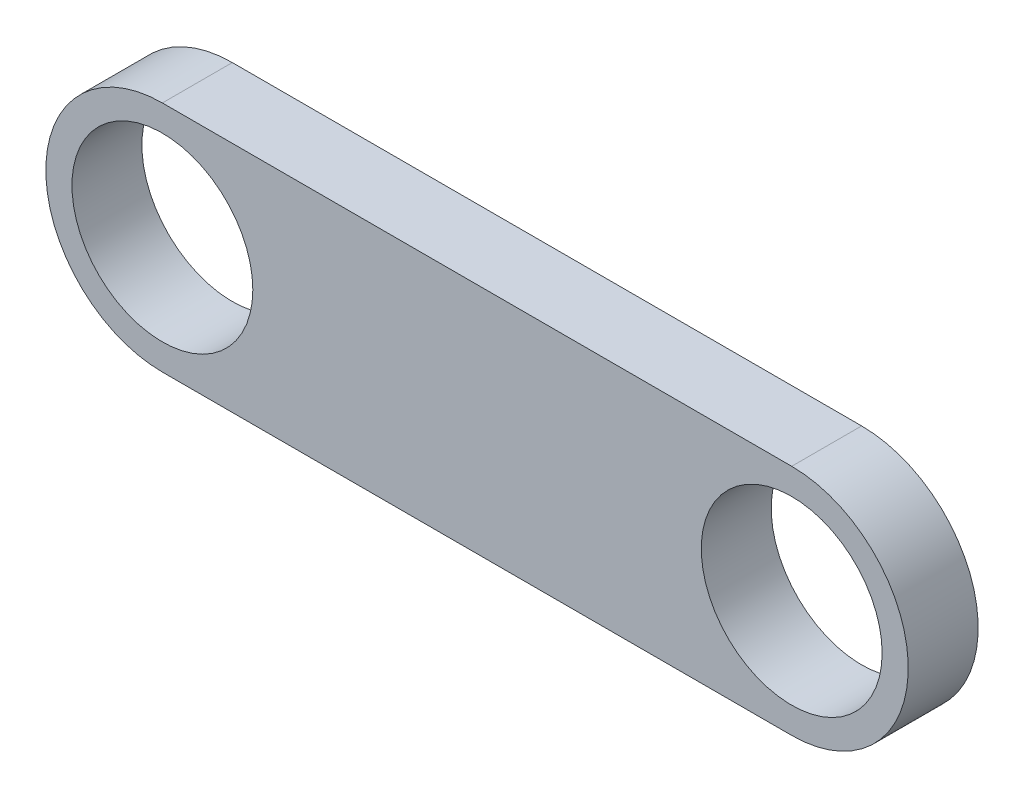
ISO-10303-21;
HEADER;
FILE_DESCRIPTION(('STEP AP214'),'2;1');
FILE_NAME('part.step','',(''),(''),'','','');
FILE_SCHEMA(('AUTOMOTIVE_DESIGN { 1 0 10303 214 1 1 1 1 }'));
ENDSEC;
DATA;
#1=APPLICATION_CONTEXT('core data for automotive mechanical design processes');
#2=APPLICATION_PROTOCOL_DEFINITION('international standard','automotive_design',2000,#1);
#3=PRODUCT_CONTEXT('',#1,'mechanical');
#4=PRODUCT('Part','Part','',(#3));
#5=PRODUCT_RELATED_PRODUCT_CATEGORY('part','',(#4));
#6=PRODUCT_DEFINITION_FORMATION('','',#4);
#7=PRODUCT_DEFINITION_CONTEXT('part definition',#1,'design');
#8=PRODUCT_DEFINITION('design','',#6,#7);
#9=PRODUCT_DEFINITION_SHAPE('','',#8);
#10=(LENGTH_UNIT() NAMED_UNIT(*) SI_UNIT(.MILLI.,.METRE.));
#11=(NAMED_UNIT(*) PLANE_ANGLE_UNIT() SI_UNIT($,.RADIAN.));
#12=(NAMED_UNIT(*) SI_UNIT($,.STERADIAN.) SOLID_ANGLE_UNIT());
#13=UNCERTAINTY_MEASURE_WITH_UNIT(LENGTH_MEASURE(1.E-05),#10,'distance_accuracy_value','');
#14=(GEOMETRIC_REPRESENTATION_CONTEXT(3) GLOBAL_UNCERTAINTY_ASSIGNED_CONTEXT((#13)) GLOBAL_UNIT_ASSIGNED_CONTEXT((#10,
#11,#12)) REPRESENTATION_CONTEXT('',''));
#15=CARTESIAN_POINT('',(0.,0.,0.));
#16=DIRECTION('',(0.,0.,1.));
#17=DIRECTION('',(1.,0.,0.));
#18=AXIS2_PLACEMENT_3D('',#15,#16,#17);
#19=CARTESIAN_POINT('',(-12.2019654064157,0.105370501409911,3.));
#20=DIRECTION('',(0.,0.,1.));
#21=DIRECTION('',(1.,0.,0.));
#22=AXIS2_PLACEMENT_3D('',#19,#20,#21);
#23=PLANE('',#22);
#24=CARTESIAN_POINT('',(-12.2019654064157,0.105370501409911,3.));
#25=DIRECTION('',(0.,0.,1.));
#26=DIRECTION('',(1.,0.,0.));
#27=AXIS2_PLACEMENT_3D('',#24,#25,#26);
#28=CIRCLE('',#27,3.88);
#29=CARTESIAN_POINT('',(-8.32196540641566,0.105370501409911,3.));
#30=VERTEX_POINT('',#29);
#31=EDGE_CURVE('E112',#30,#30,#28,.T.);
#32=ORIENTED_EDGE('',*,*,#31,.F.);
#33=EDGE_LOOP('',(#32));
#34=FACE_BOUND('',#33,.T.);
#35=CARTESIAN_POINT('',(-12.2019654064157,0.105370501409911,3.));
#36=DIRECTION('',(0.,0.,1.));
#37=DIRECTION('',(1.,0.,0.));
#38=AXIS2_PLACEMENT_3D('',#35,#36,#37);
#39=CIRCLE('',#38,5.00000000000001);
#40=CARTESIAN_POINT('',(-12.2019654064156,5.10537050140992,3.));
#41=VERTEX_POINT('',#40);
#42=CARTESIAN_POINT('',(-12.2019654064157,-4.8946294985901,3.));
#43=VERTEX_POINT('',#42);
#44=EDGE_CURVE('E92',#41,#43,#39,.T.);
#45=ORIENTED_EDGE('',*,*,#44,.T.);
#46=DIRECTION('',(1.,0.,0.));
#47=VECTOR('',#46,1.);
#48=CARTESIAN_POINT('',(-12.2019654064157,-4.8946294985901,3.));
#49=LINE('',#48,#47);
#50=CARTESIAN_POINT('',(14.7980345935843,-4.8946294985901,3.));
#51=VERTEX_POINT('',#50);
#52=EDGE_CURVE('E87',#43,#51,#49,.T.);
#53=ORIENTED_EDGE('',*,*,#52,.T.);
#54=CARTESIAN_POINT('',(14.7980345935843,0.105370501409911,3.));
#55=DIRECTION('',(0.,0.,1.));
#56=DIRECTION('',(-1.,0.,0.));
#57=AXIS2_PLACEMENT_3D('',#54,#55,#56);
#58=CIRCLE('',#57,5.00000000000001);
#59=CARTESIAN_POINT('',(14.7980345935843,5.10537050140992,3.));
#60=VERTEX_POINT('',#59);
#61=EDGE_CURVE('E90',#51,#60,#58,.T.);
#62=ORIENTED_EDGE('',*,*,#61,.T.);
#63=DIRECTION('',(-1.,0.,0.));
#64=VECTOR('',#63,1.);
#65=CARTESIAN_POINT('',(-12.2019654064156,5.10537050140992,3.));
#66=LINE('',#65,#64);
#67=EDGE_CURVE('E57',#60,#41,#66,.T.);
#68=ORIENTED_EDGE('',*,*,#67,.T.);
#69=EDGE_LOOP('',(#45,#53,#62,#68));
#70=FACE_BOUND('',#69,.T.);
#71=CARTESIAN_POINT('',(14.7980345935843,0.105370501409911,3.));
#72=DIRECTION('',(0.,0.,1.));
#73=DIRECTION('',(1.,0.,0.));
#74=AXIS2_PLACEMENT_3D('',#71,#72,#73);
#75=CIRCLE('',#74,3.88);
#76=CARTESIAN_POINT('',(18.6780345935843,0.105370501409911,3.));
#77=VERTEX_POINT('',#76);
#78=EDGE_CURVE('E134',#77,#77,#75,.T.);
#79=ORIENTED_EDGE('',*,*,#78,.F.);
#80=EDGE_LOOP('',(#79));
#81=FACE_BOUND('',#80,.T.);
#82=ADVANCED_FACE('F39',(#34,#70,#81),#23,.T.);
#83=CARTESIAN_POINT('',(-12.2019654064157,0.105370501409911,0.));
#84=DIRECTION('',(0.,0.,1.));
#85=DIRECTION('',(1.,0.,0.));
#86=AXIS2_PLACEMENT_3D('',#83,#84,#85);
#87=PLANE('',#86);
#88=CARTESIAN_POINT('',(-12.2019654064157,0.105370501409911,0.));
#89=DIRECTION('',(0.,0.,1.));
#90=DIRECTION('',(1.,0.,0.));
#91=AXIS2_PLACEMENT_3D('',#88,#89,#90);
#92=CIRCLE('',#91,5.00000000000001);
#93=CARTESIAN_POINT('',(-12.2019654064156,5.10537050140992,0.));
#94=VERTEX_POINT('',#93);
#95=CARTESIAN_POINT('',(-12.2019654064157,-4.8946294985901,0.));
#96=VERTEX_POINT('',#95);
#97=EDGE_CURVE('E108',#94,#96,#92,.T.);
#98=ORIENTED_EDGE('',*,*,#97,.F.);
#99=DIRECTION('',(-1.,0.,0.));
#100=VECTOR('',#99,1.);
#101=CARTESIAN_POINT('',(-12.2019654064156,5.10537050140992,0.));
#102=LINE('',#101,#100);
#103=CARTESIAN_POINT('',(14.7980345935843,5.10537050140992,0.));
#104=VERTEX_POINT('',#103);
#105=EDGE_CURVE('E80',#104,#94,#102,.T.);
#106=ORIENTED_EDGE('',*,*,#105,.F.);
#107=CARTESIAN_POINT('',(14.7980345935843,0.105370501409911,0.));
#108=DIRECTION('',(0.,0.,1.));
#109=DIRECTION('',(-1.,0.,0.));
#110=AXIS2_PLACEMENT_3D('',#107,#108,#109);
#111=CIRCLE('',#110,5.00000000000001);
#112=CARTESIAN_POINT('',(14.7980345935843,-4.8946294985901,0.));
#113=VERTEX_POINT('',#112);
#114=EDGE_CURVE('E74',#113,#104,#111,.T.);
#115=ORIENTED_EDGE('',*,*,#114,.F.);
#116=DIRECTION('',(1.,0.,0.));
#117=VECTOR('',#116,1.);
#118=CARTESIAN_POINT('',(-12.2019654064157,-4.8946294985901,0.));
#119=LINE('',#118,#117);
#120=EDGE_CURVE('E97',#96,#113,#119,.T.);
#121=ORIENTED_EDGE('',*,*,#120,.F.);
#122=EDGE_LOOP('',(#98,#106,#115,#121));
#123=FACE_BOUND('',#122,.T.);
#124=CARTESIAN_POINT('',(-12.2019654064157,0.105370501409911,0.));
#125=DIRECTION('',(0.,0.,1.));
#126=DIRECTION('',(1.,0.,0.));
#127=AXIS2_PLACEMENT_3D('',#124,#125,#126);
#128=CIRCLE('',#127,3.88);
#129=CARTESIAN_POINT('',(-8.32196540641566,0.105370501409911,0.));
#130=VERTEX_POINT('',#129);
#131=EDGE_CURVE('E130',#130,#130,#128,.T.);
#132=ORIENTED_EDGE('',*,*,#131,.T.);
#133=EDGE_LOOP('',(#132));
#134=FACE_BOUND('',#133,.T.);
#135=CARTESIAN_POINT('',(14.7980345935843,0.105370501409911,0.));
#136=DIRECTION('',(0.,0.,1.));
#137=DIRECTION('',(1.,0.,0.));
#138=AXIS2_PLACEMENT_3D('',#135,#136,#137);
#139=CIRCLE('',#138,3.88);
#140=CARTESIAN_POINT('',(18.6780345935843,0.105370501409911,0.));
#141=VERTEX_POINT('',#140);
#142=EDGE_CURVE('E138',#141,#141,#139,.T.);
#143=ORIENTED_EDGE('',*,*,#142,.T.);
#144=EDGE_LOOP('',(#143));
#145=FACE_BOUND('',#144,.T.);
#146=ADVANCED_FACE('F125',(#123,#134,#145),#87,.F.);
#147=CARTESIAN_POINT('',(-12.2019654064157,0.105370501409911,3.));
#148=DIRECTION('',(0.,0.,-1.));
#149=DIRECTION('',(-1.,0.,0.));
#150=AXIS2_PLACEMENT_3D('',#147,#148,#149);
#151=CYLINDRICAL_SURFACE('',#150,5.00000000000001);
#152=ORIENTED_EDGE('',*,*,#97,.T.);
#153=DIRECTION('',(0.,0.,-1.));
#154=VECTOR('',#153,1.);
#155=CARTESIAN_POINT('',(-12.2019654064157,-4.8946294985901,3.));
#156=LINE('',#155,#154);
#157=EDGE_CURVE('E11',#43,#96,#156,.T.);
#158=ORIENTED_EDGE('',*,*,#157,.F.);
#159=ORIENTED_EDGE('',*,*,#44,.F.);
#160=DIRECTION('',(0.,0.,-1.));
#161=VECTOR('',#160,1.);
#162=CARTESIAN_POINT('',(-12.2019654064156,5.10537050140992,3.));
#163=LINE('',#162,#161);
#164=EDGE_CURVE('E104',#41,#94,#163,.T.);
#165=ORIENTED_EDGE('',*,*,#164,.T.);
#166=EDGE_LOOP('',(#152,#158,#159,#165));
#167=FACE_BOUND('',#166,.T.);
#168=ADVANCED_FACE('F41',(#167),#151,.T.);
#169=CARTESIAN_POINT('',(-12.2019654064157,-4.8946294985901,3.));
#170=DIRECTION('',(0.,1.,0.));
#171=DIRECTION('',(0.,0.,1.));
#172=AXIS2_PLACEMENT_3D('',#169,#170,#171);
#173=PLANE('',#172);
#174=ORIENTED_EDGE('',*,*,#120,.T.);
#175=DIRECTION('',(0.,0.,-1.));
#176=VECTOR('',#175,1.);
#177=CARTESIAN_POINT('',(14.7980345935843,-4.8946294985901,3.));
#178=LINE('',#177,#176);
#179=EDGE_CURVE('E49',#51,#113,#178,.T.);
#180=ORIENTED_EDGE('',*,*,#179,.F.);
#181=ORIENTED_EDGE('',*,*,#52,.F.);
#182=ORIENTED_EDGE('',*,*,#157,.T.);
#183=EDGE_LOOP('',(#174,#180,#181,#182));
#184=FACE_BOUND('',#183,.T.);
#185=ADVANCED_FACE('F96',(#184),#173,.F.);
#186=CARTESIAN_POINT('',(14.7980345935843,0.105370501409911,3.));
#187=DIRECTION('',(0.,0.,-1.));
#188=DIRECTION('',(-1.,0.,0.));
#189=AXIS2_PLACEMENT_3D('',#186,#187,#188);
#190=CYLINDRICAL_SURFACE('',#189,5.00000000000001);
#191=ORIENTED_EDGE('',*,*,#114,.T.);
#192=DIRECTION('',(0.,0.,-1.));
#193=VECTOR('',#192,1.);
#194=CARTESIAN_POINT('',(14.7980345935843,5.10537050140992,3.));
#195=LINE('',#194,#193);
#196=EDGE_CURVE('E99',#60,#104,#195,.T.);
#197=ORIENTED_EDGE('',*,*,#196,.F.);
#198=ORIENTED_EDGE('',*,*,#61,.F.);
#199=ORIENTED_EDGE('',*,*,#179,.T.);
#200=EDGE_LOOP('',(#191,#197,#198,#199));
#201=FACE_BOUND('',#200,.T.);
#202=ADVANCED_FACE('F100',(#201),#190,.T.);
#203=CARTESIAN_POINT('',(-12.2019654064156,5.10537050140992,3.));
#204=DIRECTION('',(0.,-1.,0.));
#205=DIRECTION('',(0.,0.,-1.));
#206=AXIS2_PLACEMENT_3D('',#203,#204,#205);
#207=PLANE('',#206);
#208=ORIENTED_EDGE('',*,*,#105,.T.);
#209=ORIENTED_EDGE('',*,*,#164,.F.);
#210=ORIENTED_EDGE('',*,*,#67,.F.);
#211=ORIENTED_EDGE('',*,*,#196,.T.);
#212=EDGE_LOOP('',(#208,#209,#210,#211));
#213=FACE_BOUND('',#212,.T.);
#214=ADVANCED_FACE('F122',(#213),#207,.F.);
#215=CARTESIAN_POINT('',(-12.2019654064157,0.105370501409911,3.));
#216=DIRECTION('',(0.,0.,-1.));
#217=DIRECTION('',(-1.,0.,0.));
#218=AXIS2_PLACEMENT_3D('',#215,#216,#217);
#219=CYLINDRICAL_SURFACE('',#218,3.88);
#220=ORIENTED_EDGE('',*,*,#31,.T.);
#221=EDGE_LOOP('',(#220));
#222=FACE_BOUND('',#221,.T.);
#223=ORIENTED_EDGE('',*,*,#131,.F.);
#224=EDGE_LOOP('',(#223));
#225=FACE_BOUND('',#224,.T.);
#226=ADVANCED_FACE('F157',(#222,#225),#219,.F.);
#227=CARTESIAN_POINT('',(14.7980345935843,0.105370501409911,3.));
#228=DIRECTION('',(0.,0.,-1.));
#229=DIRECTION('',(-1.,0.,0.));
#230=AXIS2_PLACEMENT_3D('',#227,#228,#229);
#231=CYLINDRICAL_SURFACE('',#230,3.88);
#232=ORIENTED_EDGE('',*,*,#78,.T.);
#233=EDGE_LOOP('',(#232));
#234=FACE_BOUND('',#233,.T.);
#235=ORIENTED_EDGE('',*,*,#142,.F.);
#236=EDGE_LOOP('',(#235));
#237=FACE_BOUND('',#236,.T.);
#238=ADVANCED_FACE('F146',(#234,#237),#231,.F.);
#239=CLOSED_SHELL('',(#82,#146,#168,#185,#202,#214,#226,#238));
#240=MANIFOLD_SOLID_BREP('B2',#239);
#241=ADVANCED_BREP_SHAPE_REPRESENTATION('',(#18,#240),#14);
#242=SHAPE_DEFINITION_REPRESENTATION(#9,#241);
ENDSEC;
END-ISO-10303-21;
